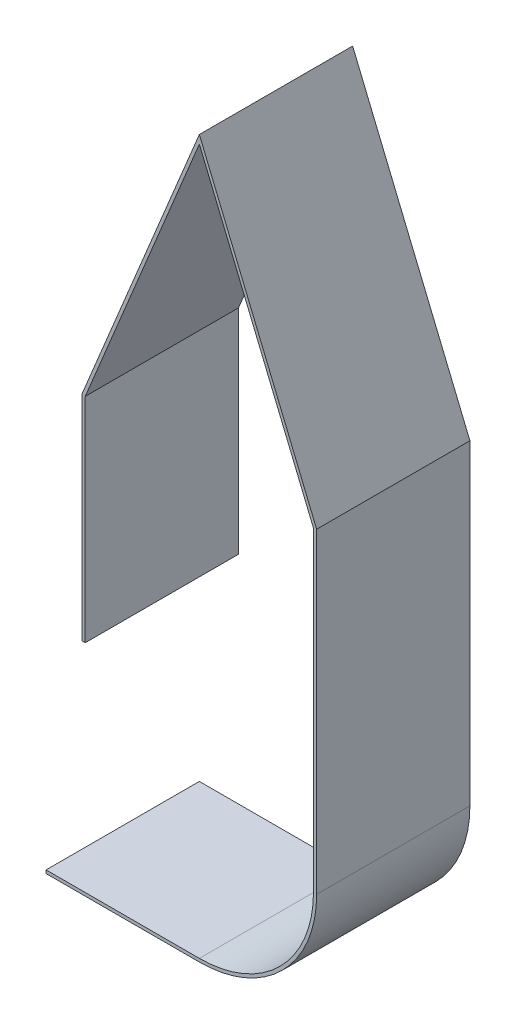
ISO-10303-21;
HEADER;
FILE_DESCRIPTION(('STEP AP214'),'2;1');
FILE_NAME('part.step','',(''),(''),'','','');
FILE_SCHEMA(('AUTOMOTIVE_DESIGN { 1 0 10303 214 1 1 1 1 }'));
ENDSEC;
DATA;
#1=APPLICATION_CONTEXT('core data for automotive mechanical design processes');
#2=APPLICATION_PROTOCOL_DEFINITION('international standard','automotive_design',2000,#1);
#3=PRODUCT_CONTEXT('',#1,'mechanical');
#4=PRODUCT('Part','Part','',(#3));
#5=PRODUCT_RELATED_PRODUCT_CATEGORY('part','',(#4));
#6=PRODUCT_DEFINITION_FORMATION('','',#4);
#7=PRODUCT_DEFINITION_CONTEXT('part definition',#1,'design');
#8=PRODUCT_DEFINITION('design','',#6,#7);
#9=PRODUCT_DEFINITION_SHAPE('','',#8);
#10=(LENGTH_UNIT() NAMED_UNIT(*) SI_UNIT(.MILLI.,.METRE.));
#11=(NAMED_UNIT(*) PLANE_ANGLE_UNIT() SI_UNIT($,.RADIAN.));
#12=(NAMED_UNIT(*) SI_UNIT($,.STERADIAN.) SOLID_ANGLE_UNIT());
#13=UNCERTAINTY_MEASURE_WITH_UNIT(LENGTH_MEASURE(1.E-05),#10,'distance_accuracy_value','');
#14=(GEOMETRIC_REPRESENTATION_CONTEXT(3) GLOBAL_UNCERTAINTY_ASSIGNED_CONTEXT((#13)) GLOBAL_UNIT_ASSIGNED_CONTEXT((#10,
#11,#12)) REPRESENTATION_CONTEXT('',''));
#15=CARTESIAN_POINT('',(0.,0.,0.));
#16=DIRECTION('',(0.,0.,1.));
#17=DIRECTION('',(1.,0.,0.));
#18=AXIS2_PLACEMENT_3D('',#15,#16,#17);
#19=CARTESIAN_POINT('',(0.,0.,-76.2));
#20=DIRECTION('',(-0.923879532511287,0.38268343236509,0.));
#21=DIRECTION('',(-0.38268343236509,-0.923879532511287,0.));
#22=AXIS2_PLACEMENT_3D('',#19,#20,#21);
#23=PLANE('',#22);
#24=DIRECTION('',(-0.38268343236509,-0.923879532511286,0.));
#25=VECTOR('',#24,1.);
#26=CARTESIAN_POINT('',(0.,0.,0.));
#27=LINE('',#26,#25);
#28=CARTESIAN_POINT('',(0.,0.,0.));
#29=VERTEX_POINT('',#28);
#30=CARTESIAN_POINT('',(-58.3209550924398,-140.79924075472,0.));
#31=VERTEX_POINT('',#30);
#32=EDGE_CURVE('E166',#29,#31,#27,.T.);
#33=ORIENTED_EDGE('',*,*,#32,.F.);
#34=DIRECTION('',(0.,0.,1.));
#35=VECTOR('',#34,1.);
#36=CARTESIAN_POINT('',(0.,0.,-76.2));
#37=LINE('',#36,#35);
#38=CARTESIAN_POINT('',(0.,0.,-76.2));
#39=VERTEX_POINT('',#38);
#40=EDGE_CURVE('E11',#39,#29,#37,.T.);
#41=ORIENTED_EDGE('',*,*,#40,.F.);
#42=DIRECTION('',(-0.38268343236509,-0.923879532511286,0.));
#43=VECTOR('',#42,1.);
#44=CARTESIAN_POINT('',(0.,0.,-76.2));
#45=LINE('',#44,#43);
#46=CARTESIAN_POINT('',(-58.3209550924398,-140.79924075472,-76.2));
#47=VERTEX_POINT('',#46);
#48=EDGE_CURVE('E204',#39,#47,#45,.T.);
#49=ORIENTED_EDGE('',*,*,#48,.T.);
#50=DIRECTION('',(0.,0.,1.));
#51=VECTOR('',#50,1.);
#52=CARTESIAN_POINT('',(-58.3209550924398,-140.79924075472,-76.2));
#53=LINE('',#52,#51);
#54=EDGE_CURVE('E36',#47,#31,#53,.T.);
#55=ORIENTED_EDGE('',*,*,#54,.T.);
#56=EDGE_LOOP('',(#33,#41,#49,#55));
#57=FACE_BOUND('',#56,.T.);
#58=ADVANCED_FACE('F33',(#57),#23,.T.);
#59=CARTESIAN_POINT('',(0.,0.,-76.2));
#60=DIRECTION('',(0.923879532511286,0.382683432365091,0.));
#61=DIRECTION('',(-0.382683432365091,0.923879532511286,0.));
#62=AXIS2_PLACEMENT_3D('',#59,#60,#61);
#63=PLANE('',#62);
#64=DIRECTION('',(-0.382683432365091,0.923879532511286,0.));
#65=VECTOR('',#64,1.);
#66=CARTESIAN_POINT('',(0.,0.,0.));
#67=LINE('',#66,#65);
#68=CARTESIAN_POINT('',(58.3209550924398,-140.79924075472,0.));
#69=VERTEX_POINT('',#68);
#70=EDGE_CURVE('E202',#69,#29,#67,.T.);
#71=ORIENTED_EDGE('',*,*,#70,.F.);
#72=DIRECTION('',(0.,0.,1.));
#73=VECTOR('',#72,1.);
#74=CARTESIAN_POINT('',(58.3209550924398,-140.79924075472,-76.2));
#75=LINE('',#74,#73);
#76=CARTESIAN_POINT('',(58.3209550924398,-140.79924075472,-76.2));
#77=VERTEX_POINT('',#76);
#78=EDGE_CURVE('E42',#77,#69,#75,.T.);
#79=ORIENTED_EDGE('',*,*,#78,.F.);
#80=DIRECTION('',(-0.382683432365091,0.923879532511286,0.));
#81=VECTOR('',#80,1.);
#82=CARTESIAN_POINT('',(0.,0.,-76.2));
#83=LINE('',#82,#81);
#84=EDGE_CURVE('E156',#77,#39,#83,.T.);
#85=ORIENTED_EDGE('',*,*,#84,.T.);
#86=ORIENTED_EDGE('',*,*,#40,.T.);
#87=EDGE_LOOP('',(#71,#79,#85,#86));
#88=FACE_BOUND('',#87,.T.);
#89=ADVANCED_FACE('F229',(#88),#63,.T.);
#90=CARTESIAN_POINT('',(58.3209550924398,-247.213806647415,-76.2));
#91=DIRECTION('',(1.,0.,0.));
#92=DIRECTION('',(0.,1.,0.));
#93=AXIS2_PLACEMENT_3D('',#90,#91,#92);
#94=PLANE('',#93);
#95=DIRECTION('',(0.,1.,0.));
#96=VECTOR('',#95,1.);
#97=CARTESIAN_POINT('',(58.3209550924398,-247.213806647415,0.));
#98=LINE('',#97,#96);
#99=CARTESIAN_POINT('',(58.3209550924398,-298.013806647415,0.));
#100=VERTEX_POINT('',#99);
#101=EDGE_CURVE('E142',#100,#69,#98,.T.);
#102=ORIENTED_EDGE('',*,*,#101,.F.);
#103=DIRECTION('',(0.,0.,1.));
#104=VECTOR('',#103,1.);
#105=CARTESIAN_POINT('',(58.3209550924398,-298.013806647415,-76.2));
#106=LINE('',#105,#104);
#107=CARTESIAN_POINT('',(58.3209550924398,-298.013806647415,-76.2));
#108=VERTEX_POINT('',#107);
#109=EDGE_CURVE('E138',#108,#100,#106,.T.);
#110=ORIENTED_EDGE('',*,*,#109,.F.);
#111=DIRECTION('',(0.,1.,0.));
#112=VECTOR('',#111,1.);
#113=CARTESIAN_POINT('',(58.3209550924398,-247.213806647415,-76.2));
#114=LINE('',#113,#112);
#115=EDGE_CURVE('E141',#108,#77,#114,.T.);
#116=ORIENTED_EDGE('',*,*,#115,.T.);
#117=ORIENTED_EDGE('',*,*,#78,.T.);
#118=EDGE_LOOP('',(#102,#110,#116,#117));
#119=FACE_BOUND('',#118,.T.);
#120=ADVANCED_FACE('F140',(#119),#94,.T.);
#121=CARTESIAN_POINT('',(0.,-298.013806647415,-76.2));
#122=DIRECTION('',(0.,0.,1.));
#123=DIRECTION('',(1.,0.,0.));
#124=AXIS2_PLACEMENT_3D('',#121,#122,#123);
#125=CYLINDRICAL_SURFACE('',#124,58.3209550924398);
#126=CARTESIAN_POINT('',(0.,-298.013806647415,0.));
#127=DIRECTION('',(0.,0.,1.));
#128=DIRECTION('',(-1.,0.,0.));
#129=AXIS2_PLACEMENT_3D('',#126,#127,#128);
#130=CIRCLE('',#129,58.3209550924398);
#131=CARTESIAN_POINT('',(0.,-356.334761739855,0.));
#132=VERTEX_POINT('',#131);
#133=EDGE_CURVE('E199',#132,#100,#130,.T.);
#134=ORIENTED_EDGE('',*,*,#133,.F.);
#135=DIRECTION('',(0.,0.,1.));
#136=VECTOR('',#135,1.);
#137=CARTESIAN_POINT('',(0.,-356.334761739855,-76.2));
#138=LINE('',#137,#136);
#139=CARTESIAN_POINT('',(0.,-356.334761739855,-76.2));
#140=VERTEX_POINT('',#139);
#141=EDGE_CURVE('E147',#140,#132,#138,.T.);
#142=ORIENTED_EDGE('',*,*,#141,.F.);
#143=CARTESIAN_POINT('',(0.,-298.013806647415,-76.2));
#144=DIRECTION('',(0.,0.,1.));
#145=DIRECTION('',(-1.,0.,0.));
#146=AXIS2_PLACEMENT_3D('',#143,#144,#145);
#147=CIRCLE('',#146,58.3209550924398);
#148=EDGE_CURVE('E154',#140,#108,#147,.T.);
#149=ORIENTED_EDGE('',*,*,#148,.T.);
#150=ORIENTED_EDGE('',*,*,#109,.T.);
#151=EDGE_LOOP('',(#134,#142,#149,#150));
#152=FACE_BOUND('',#151,.T.);
#153=ADVANCED_FACE('F158',(#152),#125,.T.);
#154=CARTESIAN_POINT('',(-76.2,-356.334761739855,-76.2));
#155=DIRECTION('',(0.,-1.,0.));
#156=DIRECTION('',(1.,0.,0.));
#157=AXIS2_PLACEMENT_3D('',#154,#155,#156);
#158=PLANE('',#157);
#159=DIRECTION('',(1.,0.,0.));
#160=VECTOR('',#159,1.);
#161=CARTESIAN_POINT('',(-76.2,-356.334761739855,0.));
#162=LINE('',#161,#160);
#163=CARTESIAN_POINT('',(-76.2,-356.334761739855,0.));
#164=VERTEX_POINT('',#163);
#165=EDGE_CURVE('E196',#164,#132,#162,.T.);
#166=ORIENTED_EDGE('',*,*,#165,.F.);
#167=DIRECTION('',(0.,0.,1.));
#168=VECTOR('',#167,1.);
#169=CARTESIAN_POINT('',(-76.2,-356.334761739855,-76.2));
#170=LINE('',#169,#168);
#171=CARTESIAN_POINT('',(-76.2,-356.334761739855,-76.2));
#172=VERTEX_POINT('',#171);
#173=EDGE_CURVE('E208',#172,#164,#170,.T.);
#174=ORIENTED_EDGE('',*,*,#173,.F.);
#175=DIRECTION('',(1.,0.,0.));
#176=VECTOR('',#175,1.);
#177=CARTESIAN_POINT('',(-76.2,-356.334761739855,-76.2));
#178=LINE('',#177,#176);
#179=EDGE_CURVE('E159',#172,#140,#178,.T.);
#180=ORIENTED_EDGE('',*,*,#179,.T.);
#181=ORIENTED_EDGE('',*,*,#141,.T.);
#182=EDGE_LOOP('',(#166,#174,#180,#181));
#183=FACE_BOUND('',#182,.T.);
#184=ADVANCED_FACE('F242',(#183),#158,.T.);
#185=CARTESIAN_POINT('',(-76.2,-354.747261739855,-76.2));
#186=DIRECTION('',(-1.,0.,0.));
#187=DIRECTION('',(0.,0.,1.));
#188=AXIS2_PLACEMENT_3D('',#185,#186,#187);
#189=PLANE('',#188);
#190=DIRECTION('',(0.,-1.,0.));
#191=VECTOR('',#190,1.);
#192=CARTESIAN_POINT('',(-76.2,-354.747261739855,0.));
#193=LINE('',#192,#191);
#194=CARTESIAN_POINT('',(-76.2,-354.747261739855,0.));
#195=VERTEX_POINT('',#194);
#196=EDGE_CURVE('E193',#195,#164,#193,.T.);
#197=ORIENTED_EDGE('',*,*,#196,.F.);
#198=DIRECTION('',(0.,0.,1.));
#199=VECTOR('',#198,1.);
#200=CARTESIAN_POINT('',(-76.2,-354.747261739855,-76.2));
#201=LINE('',#200,#199);
#202=CARTESIAN_POINT('',(-76.2,-354.747261739855,-76.2));
#203=VERTEX_POINT('',#202);
#204=EDGE_CURVE('E210',#203,#195,#201,.T.);
#205=ORIENTED_EDGE('',*,*,#204,.F.);
#206=DIRECTION('',(0.,-1.,0.));
#207=VECTOR('',#206,1.);
#208=CARTESIAN_POINT('',(-76.2,-354.747261739855,-76.2));
#209=LINE('',#208,#207);
#210=EDGE_CURVE('E161',#203,#172,#209,.T.);
#211=ORIENTED_EDGE('',*,*,#210,.T.);
#212=ORIENTED_EDGE('',*,*,#173,.T.);
#213=EDGE_LOOP('',(#197,#205,#211,#212));
#214=FACE_BOUND('',#213,.T.);
#215=ADVANCED_FACE('F245',(#214),#189,.T.);
#216=CARTESIAN_POINT('',(-76.2,-354.747261739855,-76.2));
#217=DIRECTION('',(0.,1.,0.));
#218=DIRECTION('',(0.,0.,1.));
#219=AXIS2_PLACEMENT_3D('',#216,#217,#218);
#220=PLANE('',#219);
#221=DIRECTION('',(-1.,0.,0.));
#222=VECTOR('',#221,1.);
#223=CARTESIAN_POINT('',(-76.2,-354.747261739855,0.));
#224=LINE('',#223,#222);
#225=CARTESIAN_POINT('',(0.,-354.747261739855,0.));
#226=VERTEX_POINT('',#225);
#227=EDGE_CURVE('E190',#226,#195,#224,.T.);
#228=ORIENTED_EDGE('',*,*,#227,.F.);
#229=DIRECTION('',(0.,0.,1.));
#230=VECTOR('',#229,1.);
#231=CARTESIAN_POINT('',(0.,-354.747261739855,-76.2));
#232=LINE('',#231,#230);
#233=CARTESIAN_POINT('',(0.,-354.747261739855,-76.2));
#234=VERTEX_POINT('',#233);
#235=EDGE_CURVE('E212',#234,#226,#232,.T.);
#236=ORIENTED_EDGE('',*,*,#235,.F.);
#237=DIRECTION('',(-1.,0.,0.));
#238=VECTOR('',#237,1.);
#239=CARTESIAN_POINT('',(-76.2,-354.747261739855,-76.2));
#240=LINE('',#239,#238);
#241=EDGE_CURVE('E407',#234,#203,#240,.T.);
#242=ORIENTED_EDGE('',*,*,#241,.T.);
#243=ORIENTED_EDGE('',*,*,#204,.T.);
#244=EDGE_LOOP('',(#228,#236,#242,#243));
#245=FACE_BOUND('',#244,.T.);
#246=ADVANCED_FACE('F249',(#245),#220,.T.);
#247=CARTESIAN_POINT('',(0.,-298.013806647415,-76.2));
#248=DIRECTION('',(0.,0.,1.));
#249=DIRECTION('',(1.,0.,0.));
#250=AXIS2_PLACEMENT_3D('',#247,#248,#249);
#251=CYLINDRICAL_SURFACE('',#250,56.7334550924398);
#252=CARTESIAN_POINT('',(0.,-298.013806647415,0.));
#253=DIRECTION('',(0.,0.,-1.));
#254=DIRECTION('',(-1.,0.,0.));
#255=AXIS2_PLACEMENT_3D('',#252,#253,#254);
#256=CIRCLE('',#255,56.7334550924398);
#257=CARTESIAN_POINT('',(56.7334550924398,-298.013806647415,0.));
#258=VERTEX_POINT('',#257);
#259=EDGE_CURVE('E187',#258,#226,#256,.T.);
#260=ORIENTED_EDGE('',*,*,#259,.F.);
#261=DIRECTION('',(0.,0.,1.));
#262=VECTOR('',#261,1.);
#263=CARTESIAN_POINT('',(56.7334550924398,-298.013806647415,-76.2));
#264=LINE('',#263,#262);
#265=CARTESIAN_POINT('',(56.7334550924398,-298.013806647415,-76.2));
#266=VERTEX_POINT('',#265);
#267=EDGE_CURVE('E214',#266,#258,#264,.T.);
#268=ORIENTED_EDGE('',*,*,#267,.F.);
#269=CARTESIAN_POINT('',(0.,-298.013806647415,-76.2));
#270=DIRECTION('',(0.,0.,-1.));
#271=DIRECTION('',(-1.,0.,0.));
#272=AXIS2_PLACEMENT_3D('',#269,#270,#271);
#273=CIRCLE('',#272,56.7334550924398);
#274=EDGE_CURVE('E400',#266,#234,#273,.T.);
#275=ORIENTED_EDGE('',*,*,#274,.T.);
#276=ORIENTED_EDGE('',*,*,#235,.T.);
#277=EDGE_LOOP('',(#260,#268,#275,#276));
#278=FACE_BOUND('',#277,.T.);
#279=ADVANCED_FACE('F253',(#278),#251,.F.);
#280=CARTESIAN_POINT('',(56.7334550924398,-247.213806647415,-76.2));
#281=DIRECTION('',(-1.,0.,0.));
#282=DIRECTION('',(0.,-1.,0.));
#283=AXIS2_PLACEMENT_3D('',#280,#281,#282);
#284=PLANE('',#283);
#285=DIRECTION('',(0.,-1.,0.));
#286=VECTOR('',#285,1.);
#287=CARTESIAN_POINT('',(56.7334550924398,-247.213806647415,0.));
#288=LINE('',#287,#286);
#289=CARTESIAN_POINT('',(56.7334550924398,-141.115014137935,0.));
#290=VERTEX_POINT('',#289);
#291=EDGE_CURVE('E184',#290,#258,#288,.T.);
#292=ORIENTED_EDGE('',*,*,#291,.F.);
#293=DIRECTION('',(0.,0.,1.));
#294=VECTOR('',#293,1.);
#295=CARTESIAN_POINT('',(56.7334550924398,-141.115014137935,-76.2));
#296=LINE('',#295,#294);
#297=CARTESIAN_POINT('',(56.7334550924398,-141.115014137935,-76.2));
#298=VERTEX_POINT('',#297);
#299=EDGE_CURVE('E216',#298,#290,#296,.T.);
#300=ORIENTED_EDGE('',*,*,#299,.F.);
#301=DIRECTION('',(0.,-1.,0.));
#302=VECTOR('',#301,1.);
#303=CARTESIAN_POINT('',(56.7334550924398,-247.213806647415,-76.2));
#304=LINE('',#303,#302);
#305=EDGE_CURVE('E396',#298,#266,#304,.T.);
#306=ORIENTED_EDGE('',*,*,#305,.T.);
#307=ORIENTED_EDGE('',*,*,#267,.T.);
#308=EDGE_LOOP('',(#292,#300,#306,#307));
#309=FACE_BOUND('',#308,.T.);
#310=ADVANCED_FACE('F257',(#309),#284,.T.);
#311=CARTESIAN_POINT('',(0.,-4.14833741348249,-76.2));
#312=DIRECTION('',(-0.923879532511286,-0.382683432365091,0.));
#313=DIRECTION('',(0.382683432365091,-0.923879532511286,0.));
#314=AXIS2_PLACEMENT_3D('',#311,#312,#313);
#315=PLANE('',#314);
#316=DIRECTION('',(0.382683432365091,-0.923879532511286,0.));
#317=VECTOR('',#316,1.);
#318=CARTESIAN_POINT('',(0.,-4.14833741348249,0.));
#319=LINE('',#318,#317);
#320=CARTESIAN_POINT('',(0.,-4.14833741348249,0.));
#321=VERTEX_POINT('',#320);
#322=EDGE_CURVE('E181',#321,#290,#319,.T.);
#323=ORIENTED_EDGE('',*,*,#322,.F.);
#324=DIRECTION('',(0.,0.,1.));
#325=VECTOR('',#324,1.);
#326=CARTESIAN_POINT('',(0.,-4.14833741348249,-76.2));
#327=LINE('',#326,#325);
#328=CARTESIAN_POINT('',(0.,-4.14833741348249,-76.2));
#329=VERTEX_POINT('',#328);
#330=EDGE_CURVE('E219',#329,#321,#327,.T.);
#331=ORIENTED_EDGE('',*,*,#330,.F.);
#332=DIRECTION('',(0.382683432365091,-0.923879532511286,0.));
#333=VECTOR('',#332,1.);
#334=CARTESIAN_POINT('',(0.,-4.14833741348249,-76.2));
#335=LINE('',#334,#333);
#336=EDGE_CURVE('E412',#329,#298,#335,.T.);
#337=ORIENTED_EDGE('',*,*,#336,.T.);
#338=ORIENTED_EDGE('',*,*,#299,.T.);
#339=EDGE_LOOP('',(#323,#331,#337,#338));
#340=FACE_BOUND('',#339,.T.);
#341=ADVANCED_FACE('F261',(#340),#315,.T.);
#342=CARTESIAN_POINT('',(0.,-4.14833741348249,-76.2));
#343=DIRECTION('',(0.923879532511286,-0.38268343236509,0.));
#344=DIRECTION('',(0.382683432365091,0.923879532511287,0.));
#345=AXIS2_PLACEMENT_3D('',#342,#343,#344);
#346=PLANE('',#345);
#347=DIRECTION('',(0.382683432365091,0.923879532511287,0.));
#348=VECTOR('',#347,1.);
#349=CARTESIAN_POINT('',(0.,-4.14833741348249,0.));
#350=LINE('',#349,#348);
#351=CARTESIAN_POINT('',(-56.7334550924398,-141.115014137935,0.));
#352=VERTEX_POINT('',#351);
#353=EDGE_CURVE('E178',#352,#321,#350,.T.);
#354=ORIENTED_EDGE('',*,*,#353,.F.);
#355=DIRECTION('',(0.,0.,1.));
#356=VECTOR('',#355,1.);
#357=CARTESIAN_POINT('',(-56.7334550924398,-141.115014137935,-76.2));
#358=LINE('',#357,#356);
#359=CARTESIAN_POINT('',(-56.7334550924398,-141.115014137935,-76.2));
#360=VERTEX_POINT('',#359);
#361=EDGE_CURVE('E221',#360,#352,#358,.T.);
#362=ORIENTED_EDGE('',*,*,#361,.F.);
#363=DIRECTION('',(0.382683432365091,0.923879532511287,0.));
#364=VECTOR('',#363,1.);
#365=CARTESIAN_POINT('',(0.,-4.14833741348249,-76.2));
#366=LINE('',#365,#364);
#367=EDGE_CURVE('E390',#360,#329,#366,.T.);
#368=ORIENTED_EDGE('',*,*,#367,.T.);
#369=ORIENTED_EDGE('',*,*,#330,.T.);
#370=EDGE_LOOP('',(#354,#362,#368,#369));
#371=FACE_BOUND('',#370,.T.);
#372=ADVANCED_FACE('F265',(#371),#346,.T.);
#373=CARTESIAN_POINT('',(-56.7334550924398,-141.115014137935,-76.2));
#374=DIRECTION('',(1.,0.,0.));
#375=DIRECTION('',(0.,0.,-1.));
#376=AXIS2_PLACEMENT_3D('',#373,#374,#375);
#377=PLANE('',#376);
#378=DIRECTION('',(0.,1.,0.));
#379=VECTOR('',#378,1.);
#380=CARTESIAN_POINT('',(-56.7334550924398,-141.115014137935,0.));
#381=LINE('',#380,#379);
#382=CARTESIAN_POINT('',(-56.7334550924398,-247.213806647415,0.));
#383=VERTEX_POINT('',#382);
#384=EDGE_CURVE('E175',#383,#352,#381,.T.);
#385=ORIENTED_EDGE('',*,*,#384,.F.);
#386=DIRECTION('',(0.,0.,1.));
#387=VECTOR('',#386,1.);
#388=CARTESIAN_POINT('',(-56.7334550924398,-247.213806647415,-76.2));
#389=LINE('',#388,#387);
#390=CARTESIAN_POINT('',(-56.7334550924398,-247.213806647415,-76.2));
#391=VERTEX_POINT('',#390);
#392=EDGE_CURVE('E223',#391,#383,#389,.T.);
#393=ORIENTED_EDGE('',*,*,#392,.F.);
#394=DIRECTION('',(0.,1.,0.));
#395=VECTOR('',#394,1.);
#396=CARTESIAN_POINT('',(-56.7334550924398,-141.115014137935,-76.2));
#397=LINE('',#396,#395);
#398=EDGE_CURVE('E386',#391,#360,#397,.T.);
#399=ORIENTED_EDGE('',*,*,#398,.T.);
#400=ORIENTED_EDGE('',*,*,#361,.T.);
#401=EDGE_LOOP('',(#385,#393,#399,#400));
#402=FACE_BOUND('',#401,.T.);
#403=ADVANCED_FACE('F269',(#402),#377,.T.);
#404=CARTESIAN_POINT('',(-56.7334550924398,-247.213806647415,-76.2));
#405=DIRECTION('',(0.,-1.,0.));
#406=DIRECTION('',(0.,0.,-1.));
#407=AXIS2_PLACEMENT_3D('',#404,#405,#406);
#408=PLANE('',#407);
#409=DIRECTION('',(1.,0.,0.));
#410=VECTOR('',#409,1.);
#411=CARTESIAN_POINT('',(-56.7334550924398,-247.213806647415,0.));
#412=LINE('',#411,#410);
#413=CARTESIAN_POINT('',(-58.3209550924398,-247.213806647415,0.));
#414=VERTEX_POINT('',#413);
#415=EDGE_CURVE('E172',#414,#383,#412,.T.);
#416=ORIENTED_EDGE('',*,*,#415,.F.);
#417=DIRECTION('',(0.,0.,1.));
#418=VECTOR('',#417,1.);
#419=CARTESIAN_POINT('',(-58.3209550924398,-247.213806647415,-76.2));
#420=LINE('',#419,#418);
#421=CARTESIAN_POINT('',(-58.3209550924398,-247.213806647415,-76.2));
#422=VERTEX_POINT('',#421);
#423=EDGE_CURVE('E224',#422,#414,#420,.T.);
#424=ORIENTED_EDGE('',*,*,#423,.F.);
#425=DIRECTION('',(1.,0.,0.));
#426=VECTOR('',#425,1.);
#427=CARTESIAN_POINT('',(-56.7334550924398,-247.213806647415,-76.2));
#428=LINE('',#427,#426);
#429=EDGE_CURVE('E416',#422,#391,#428,.T.);
#430=ORIENTED_EDGE('',*,*,#429,.T.);
#431=ORIENTED_EDGE('',*,*,#392,.T.);
#432=EDGE_LOOP('',(#416,#424,#430,#431));
#433=FACE_BOUND('',#432,.T.);
#434=ADVANCED_FACE('F273',(#433),#408,.T.);
#435=CARTESIAN_POINT('',(-58.3209550924398,-140.79924075472,-76.2));
#436=DIRECTION('',(-1.,0.,0.));
#437=DIRECTION('',(0.,-1.,0.));
#438=AXIS2_PLACEMENT_3D('',#435,#436,#437);
#439=PLANE('',#438);
#440=DIRECTION('',(0.,-1.,0.));
#441=VECTOR('',#440,1.);
#442=CARTESIAN_POINT('',(-58.3209550924398,-140.79924075472,0.));
#443=LINE('',#442,#441);
#444=EDGE_CURVE('E169',#31,#414,#443,.T.);
#445=ORIENTED_EDGE('',*,*,#444,.F.);
#446=ORIENTED_EDGE('',*,*,#54,.F.);
#447=DIRECTION('',(0.,-1.,0.));
#448=VECTOR('',#447,1.);
#449=CARTESIAN_POINT('',(-58.3209550924398,-140.79924075472,-76.2));
#450=LINE('',#449,#448);
#451=EDGE_CURVE('E418',#47,#422,#450,.T.);
#452=ORIENTED_EDGE('',*,*,#451,.T.);
#453=ORIENTED_EDGE('',*,*,#423,.T.);
#454=EDGE_LOOP('',(#445,#446,#452,#453));
#455=FACE_BOUND('',#454,.T.);
#456=ADVANCED_FACE('F226',(#455),#439,.T.);
#457=CARTESIAN_POINT('',(0.,-298.013806647415,-76.2));
#458=DIRECTION('',(0.,0.,-1.));
#459=DIRECTION('',(-1.,0.,0.));
#460=AXIS2_PLACEMENT_3D('',#457,#458,#459);
#461=PLANE('',#460);
#462=ORIENTED_EDGE('',*,*,#48,.F.);
#463=ORIENTED_EDGE('',*,*,#84,.F.);
#464=ORIENTED_EDGE('',*,*,#115,.F.);
#465=ORIENTED_EDGE('',*,*,#148,.F.);
#466=ORIENTED_EDGE('',*,*,#179,.F.);
#467=ORIENTED_EDGE('',*,*,#210,.F.);
#468=ORIENTED_EDGE('',*,*,#241,.F.);
#469=ORIENTED_EDGE('',*,*,#274,.F.);
#470=ORIENTED_EDGE('',*,*,#305,.F.);
#471=ORIENTED_EDGE('',*,*,#336,.F.);
#472=ORIENTED_EDGE('',*,*,#367,.F.);
#473=ORIENTED_EDGE('',*,*,#398,.F.);
#474=ORIENTED_EDGE('',*,*,#429,.F.);
#475=ORIENTED_EDGE('',*,*,#451,.F.);
#476=EDGE_LOOP('',(#462,#463,#464,#465,#466,#467,#468,#469,#470,#471,#472,#473,#474,#475));
#477=FACE_BOUND('',#476,.T.);
#478=ADVANCED_FACE('F152',(#477),#461,.T.);
#479=CARTESIAN_POINT('',(0.,-298.013806647415,0.));
#480=DIRECTION('',(0.,0.,-1.));
#481=DIRECTION('',(-1.,0.,0.));
#482=AXIS2_PLACEMENT_3D('',#479,#480,#481);
#483=PLANE('',#482);
#484=ORIENTED_EDGE('',*,*,#32,.T.);
#485=ORIENTED_EDGE('',*,*,#444,.T.);
#486=ORIENTED_EDGE('',*,*,#415,.T.);
#487=ORIENTED_EDGE('',*,*,#384,.T.);
#488=ORIENTED_EDGE('',*,*,#353,.T.);
#489=ORIENTED_EDGE('',*,*,#322,.T.);
#490=ORIENTED_EDGE('',*,*,#291,.T.);
#491=ORIENTED_EDGE('',*,*,#259,.T.);
#492=ORIENTED_EDGE('',*,*,#227,.T.);
#493=ORIENTED_EDGE('',*,*,#196,.T.);
#494=ORIENTED_EDGE('',*,*,#165,.T.);
#495=ORIENTED_EDGE('',*,*,#133,.T.);
#496=ORIENTED_EDGE('',*,*,#101,.T.);
#497=ORIENTED_EDGE('',*,*,#70,.T.);
#498=EDGE_LOOP('',(#484,#485,#486,#487,#488,#489,#490,#491,#492,#493,#494,#495,#496,#497));
#499=FACE_BOUND('',#498,.T.);
#500=ADVANCED_FACE('F228',(#499),#483,.F.);
#501=CLOSED_SHELL('',(#58,#89,#120,#153,#184,#215,#246,#279,#310,#341,#372,#403,#434,#456,#478,#500));
#502=MANIFOLD_SOLID_BREP('B2',#501);
#503=ADVANCED_BREP_SHAPE_REPRESENTATION('',(#18,#502),#14);
#504=SHAPE_DEFINITION_REPRESENTATION(#9,#503);
ENDSEC;
END-ISO-10303-21;
